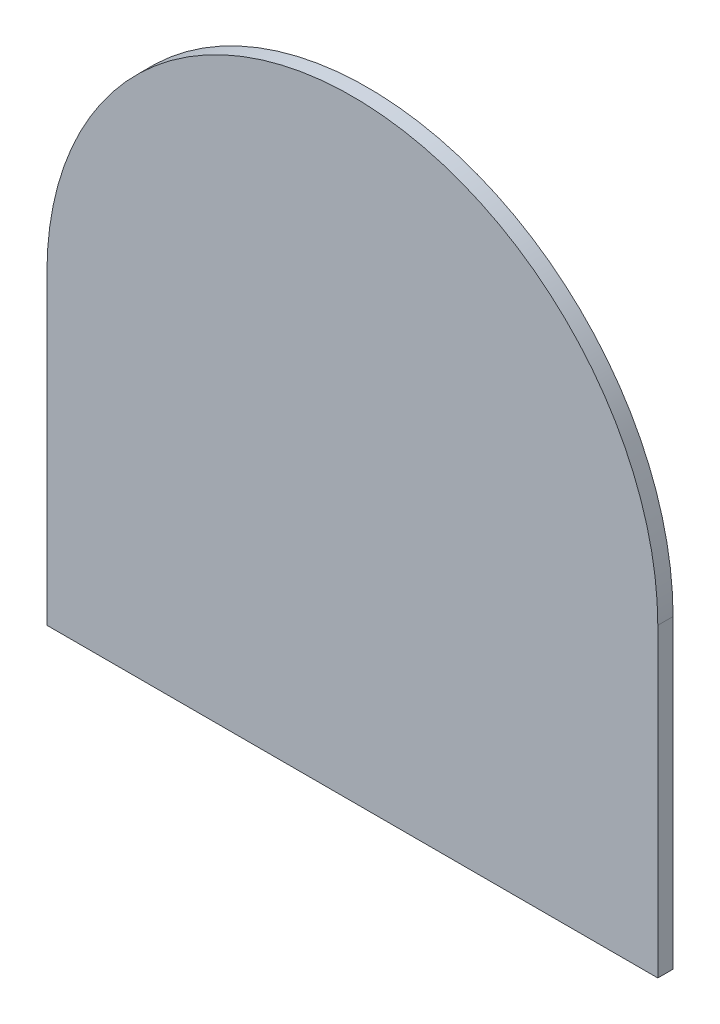
ISO-10303-21;
HEADER;
FILE_DESCRIPTION(('STEP AP214'),'2;1');
FILE_NAME('part.step','',(''),(''),'','','');
FILE_SCHEMA(('AUTOMOTIVE_DESIGN { 1 0 10303 214 1 1 1 1 }'));
ENDSEC;
DATA;
#1=APPLICATION_CONTEXT('core data for automotive mechanical design processes');
#2=APPLICATION_PROTOCOL_DEFINITION('international standard','automotive_design',2000,#1);
#3=PRODUCT_CONTEXT('',#1,'mechanical');
#4=PRODUCT('Part','Part','',(#3));
#5=PRODUCT_RELATED_PRODUCT_CATEGORY('part','',(#4));
#6=PRODUCT_DEFINITION_FORMATION('','',#4);
#7=PRODUCT_DEFINITION_CONTEXT('part definition',#1,'design');
#8=PRODUCT_DEFINITION('design','',#6,#7);
#9=PRODUCT_DEFINITION_SHAPE('','',#8);
#10=(LENGTH_UNIT() NAMED_UNIT(*) SI_UNIT(.MILLI.,.METRE.));
#11=(NAMED_UNIT(*) PLANE_ANGLE_UNIT() SI_UNIT($,.RADIAN.));
#12=(NAMED_UNIT(*) SI_UNIT($,.STERADIAN.) SOLID_ANGLE_UNIT());
#13=UNCERTAINTY_MEASURE_WITH_UNIT(LENGTH_MEASURE(1.E-05),#10,'distance_accuracy_value','');
#14=(GEOMETRIC_REPRESENTATION_CONTEXT(3) GLOBAL_UNCERTAINTY_ASSIGNED_CONTEXT((#13)) GLOBAL_UNIT_ASSIGNED_CONTEXT((#10,
#11,#12)) REPRESENTATION_CONTEXT('',''));
#15=CARTESIAN_POINT('',(0.,0.,0.));
#16=DIRECTION('',(0.,0.,1.));
#17=DIRECTION('',(1.,0.,0.));
#18=AXIS2_PLACEMENT_3D('',#15,#16,#17);
#19=CARTESIAN_POINT('',(0.,0.,-3.175));
#20=DIRECTION('',(-1.,0.,0.));
#21=DIRECTION('',(0.,0.,1.));
#22=AXIS2_PLACEMENT_3D('',#19,#20,#21);
#23=PLANE('',#22);
#24=DIRECTION('',(0.,-1.,0.));
#25=VECTOR('',#24,1.);
#26=CARTESIAN_POINT('',(0.,0.,0.));
#27=LINE('',#26,#25);
#28=CARTESIAN_POINT('',(0.,63.5,0.));
#29=VERTEX_POINT('',#28);
#30=CARTESIAN_POINT('',(0.,0.,0.));
#31=VERTEX_POINT('',#30);
#32=EDGE_CURVE('E95',#29,#31,#27,.T.);
#33=ORIENTED_EDGE('',*,*,#32,.F.);
#34=DIRECTION('',(0.,0.,1.));
#35=VECTOR('',#34,1.);
#36=CARTESIAN_POINT('',(0.,63.5,-3.175));
#37=LINE('',#36,#35);
#38=CARTESIAN_POINT('',(0.,63.5,-3.175));
#39=VERTEX_POINT('',#38);
#40=EDGE_CURVE('E11',#39,#29,#37,.T.);
#41=ORIENTED_EDGE('',*,*,#40,.F.);
#42=DIRECTION('',(0.,-1.,0.));
#43=VECTOR('',#42,1.);
#44=CARTESIAN_POINT('',(0.,0.,-3.175));
#45=LINE('',#44,#43);
#46=CARTESIAN_POINT('',(0.,0.,-3.175));
#47=VERTEX_POINT('',#46);
#48=EDGE_CURVE('E89',#39,#47,#45,.T.);
#49=ORIENTED_EDGE('',*,*,#48,.T.);
#50=DIRECTION('',(0.,0.,1.));
#51=VECTOR('',#50,1.);
#52=CARTESIAN_POINT('',(0.,0.,-3.175));
#53=LINE('',#52,#51);
#54=EDGE_CURVE('E34',#47,#31,#53,.T.);
#55=ORIENTED_EDGE('',*,*,#54,.T.);
#56=EDGE_LOOP('',(#33,#41,#49,#55));
#57=FACE_BOUND('',#56,.T.);
#58=ADVANCED_FACE('F31',(#57),#23,.T.);
#59=CARTESIAN_POINT('',(63.5,63.5,-3.175));
#60=DIRECTION('',(0.,0.,1.));
#61=DIRECTION('',(1.,0.,0.));
#62=AXIS2_PLACEMENT_3D('',#59,#60,#61);
#63=CYLINDRICAL_SURFACE('',#62,63.5);
#64=CARTESIAN_POINT('',(63.5,63.5,0.));
#65=DIRECTION('',(0.,0.,1.));
#66=DIRECTION('',(1.,0.,0.));
#67=AXIS2_PLACEMENT_3D('',#64,#65,#66);
#68=CIRCLE('',#67,63.5);
#69=CARTESIAN_POINT('',(127.,63.5,0.));
#70=VERTEX_POINT('',#69);
#71=EDGE_CURVE('E91',#70,#29,#68,.T.);
#72=ORIENTED_EDGE('',*,*,#71,.F.);
#73=DIRECTION('',(0.,0.,1.));
#74=VECTOR('',#73,1.);
#75=CARTESIAN_POINT('',(127.,63.5,-3.175));
#76=LINE('',#75,#74);
#77=CARTESIAN_POINT('',(127.,63.5,-3.175));
#78=VERTEX_POINT('',#77);
#79=EDGE_CURVE('E40',#78,#70,#76,.T.);
#80=ORIENTED_EDGE('',*,*,#79,.F.);
#81=CARTESIAN_POINT('',(63.5,63.5,-3.175));
#82=DIRECTION('',(0.,0.,1.));
#83=DIRECTION('',(1.,0.,0.));
#84=AXIS2_PLACEMENT_3D('',#81,#82,#83);
#85=CIRCLE('',#84,63.5);
#86=EDGE_CURVE('E86',#78,#39,#85,.T.);
#87=ORIENTED_EDGE('',*,*,#86,.T.);
#88=ORIENTED_EDGE('',*,*,#40,.T.);
#89=EDGE_LOOP('',(#72,#80,#87,#88));
#90=FACE_BOUND('',#89,.T.);
#91=ADVANCED_FACE('F105',(#90),#63,.T.);
#92=CARTESIAN_POINT('',(127.,0.,-3.175));
#93=DIRECTION('',(1.,0.,0.));
#94=DIRECTION('',(0.,0.,-1.));
#95=AXIS2_PLACEMENT_3D('',#92,#93,#94);
#96=PLANE('',#95);
#97=DIRECTION('',(0.,1.,0.));
#98=VECTOR('',#97,1.);
#99=CARTESIAN_POINT('',(127.,0.,0.));
#100=LINE('',#99,#98);
#101=CARTESIAN_POINT('',(127.,0.,0.));
#102=VERTEX_POINT('',#101);
#103=EDGE_CURVE('E81',#102,#70,#100,.T.);
#104=ORIENTED_EDGE('',*,*,#103,.F.);
#105=DIRECTION('',(0.,0.,1.));
#106=VECTOR('',#105,1.);
#107=CARTESIAN_POINT('',(127.,0.,-3.175));
#108=LINE('',#107,#106);
#109=CARTESIAN_POINT('',(127.,0.,-3.175));
#110=VERTEX_POINT('',#109);
#111=EDGE_CURVE('E76',#110,#102,#108,.T.);
#112=ORIENTED_EDGE('',*,*,#111,.F.);
#113=DIRECTION('',(0.,1.,0.));
#114=VECTOR('',#113,1.);
#115=CARTESIAN_POINT('',(127.,0.,-3.175));
#116=LINE('',#115,#114);
#117=EDGE_CURVE('E79',#110,#78,#116,.T.);
#118=ORIENTED_EDGE('',*,*,#117,.T.);
#119=ORIENTED_EDGE('',*,*,#79,.T.);
#120=EDGE_LOOP('',(#104,#112,#118,#119));
#121=FACE_BOUND('',#120,.T.);
#122=ADVANCED_FACE('F78',(#121),#96,.T.);
#123=CARTESIAN_POINT('',(0.,0.,-3.175));
#124=DIRECTION('',(0.,-1.,0.));
#125=DIRECTION('',(0.,0.,-1.));
#126=AXIS2_PLACEMENT_3D('',#123,#124,#125);
#127=PLANE('',#126);
#128=DIRECTION('',(1.,0.,0.));
#129=VECTOR('',#128,1.);
#130=CARTESIAN_POINT('',(0.,0.,0.));
#131=LINE('',#130,#129);
#132=EDGE_CURVE('E98',#31,#102,#131,.T.);
#133=ORIENTED_EDGE('',*,*,#132,.F.);
#134=ORIENTED_EDGE('',*,*,#54,.F.);
#135=DIRECTION('',(1.,0.,0.));
#136=VECTOR('',#135,1.);
#137=CARTESIAN_POINT('',(0.,0.,-3.175));
#138=LINE('',#137,#136);
#139=EDGE_CURVE('E85',#47,#110,#138,.T.);
#140=ORIENTED_EDGE('',*,*,#139,.T.);
#141=ORIENTED_EDGE('',*,*,#111,.T.);
#142=EDGE_LOOP('',(#133,#134,#140,#141));
#143=FACE_BOUND('',#142,.T.);
#144=ADVANCED_FACE('F88',(#143),#127,.T.);
#145=CARTESIAN_POINT('',(63.5,63.5,-3.175));
#146=DIRECTION('',(0.,0.,1.));
#147=DIRECTION('',(1.,0.,0.));
#148=AXIS2_PLACEMENT_3D('',#145,#146,#147);
#149=PLANE('',#148);
#150=ORIENTED_EDGE('',*,*,#48,.F.);
#151=ORIENTED_EDGE('',*,*,#86,.F.);
#152=ORIENTED_EDGE('',*,*,#117,.F.);
#153=ORIENTED_EDGE('',*,*,#139,.F.);
#154=EDGE_LOOP('',(#150,#151,#152,#153));
#155=FACE_BOUND('',#154,.T.);
#156=ADVANCED_FACE('F84',(#155),#149,.F.);
#157=CARTESIAN_POINT('',(63.5,63.5,0.));
#158=DIRECTION('',(0.,0.,1.));
#159=DIRECTION('',(1.,0.,0.));
#160=AXIS2_PLACEMENT_3D('',#157,#158,#159);
#161=PLANE('',#160);
#162=ORIENTED_EDGE('',*,*,#32,.T.);
#163=ORIENTED_EDGE('',*,*,#132,.T.);
#164=ORIENTED_EDGE('',*,*,#103,.T.);
#165=ORIENTED_EDGE('',*,*,#71,.T.);
#166=EDGE_LOOP('',(#162,#163,#164,#165));
#167=FACE_BOUND('',#166,.T.);
#168=ADVANCED_FACE('F104',(#167),#161,.T.);
#169=CLOSED_SHELL('',(#58,#91,#122,#144,#156,#168));
#170=MANIFOLD_SOLID_BREP('B2',#169);
#171=ADVANCED_BREP_SHAPE_REPRESENTATION('',(#18,#170),#14);
#172=SHAPE_DEFINITION_REPRESENTATION(#9,#171);
ENDSEC;
END-ISO-10303-21;
